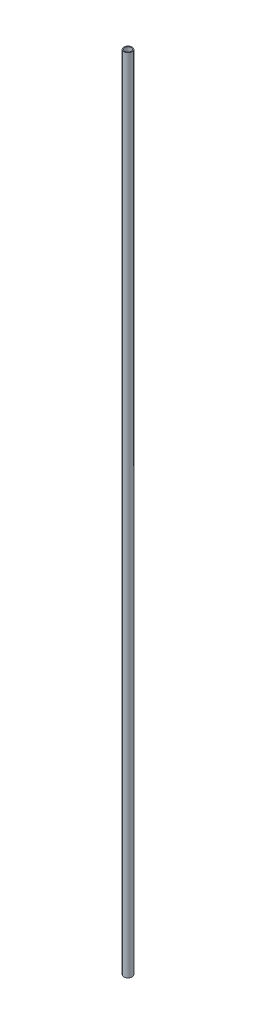
ISO-10303-21;
HEADER;
FILE_DESCRIPTION(('STEP AP214'),'2;1');
FILE_NAME('part.step','',(''),(''),'','','');
FILE_SCHEMA(('AUTOMOTIVE_DESIGN { 1 0 10303 214 1 1 1 1 }'));
ENDSEC;
DATA;
#1=APPLICATION_CONTEXT('core data for automotive mechanical design processes');
#2=APPLICATION_PROTOCOL_DEFINITION('international standard','automotive_design',2000,#1);
#3=PRODUCT_CONTEXT('',#1,'mechanical');
#4=PRODUCT('Part','Part','',(#3));
#5=PRODUCT_RELATED_PRODUCT_CATEGORY('part','',(#4));
#6=PRODUCT_DEFINITION_FORMATION('','',#4);
#7=PRODUCT_DEFINITION_CONTEXT('part definition',#1,'design');
#8=PRODUCT_DEFINITION('design','',#6,#7);
#9=PRODUCT_DEFINITION_SHAPE('','',#8);
#10=(LENGTH_UNIT() NAMED_UNIT(*) SI_UNIT(.MILLI.,.METRE.));
#11=(NAMED_UNIT(*) PLANE_ANGLE_UNIT() SI_UNIT($,.RADIAN.));
#12=(NAMED_UNIT(*) SI_UNIT($,.STERADIAN.) SOLID_ANGLE_UNIT());
#13=UNCERTAINTY_MEASURE_WITH_UNIT(LENGTH_MEASURE(1.E-05),#10,'distance_accuracy_value','');
#14=(GEOMETRIC_REPRESENTATION_CONTEXT(3) GLOBAL_UNCERTAINTY_ASSIGNED_CONTEXT((#13)) GLOBAL_UNIT_ASSIGNED_CONTEXT((#10,
#11,#12)) REPRESENTATION_CONTEXT('',''));
#15=CARTESIAN_POINT('',(0.,0.,0.));
#16=DIRECTION('',(0.,0.,1.));
#17=DIRECTION('',(1.,0.,0.));
#18=AXIS2_PLACEMENT_3D('',#15,#16,#17);
#19=CARTESIAN_POINT('',(0.,0.,0.));
#20=DIRECTION('',(0.,1.,0.));
#21=DIRECTION('',(0.,0.,1.));
#22=AXIS2_PLACEMENT_3D('',#19,#20,#21);
#23=CYLINDRICAL_SURFACE('',#22,5.);
#24=CARTESIAN_POINT('',(0.,1236.994,0.));
#25=DIRECTION('',(0.,1.,0.));
#26=DIRECTION('',(0.,0.,1.));
#27=AXIS2_PLACEMENT_3D('',#24,#25,#26);
#28=CIRCLE('',#27,5.);
#29=CARTESIAN_POINT('',(0.,1236.994,5.));
#30=VERTEX_POINT('',#29);
#31=EDGE_CURVE('E18',#30,#30,#28,.F.);
#32=ORIENTED_EDGE('',*,*,#31,.F.);
#33=EDGE_LOOP('',(#32));
#34=FACE_BOUND('',#33,.T.);
#35=CARTESIAN_POINT('',(0.,0.,0.));
#36=DIRECTION('',(0.,1.,0.));
#37=DIRECTION('',(0.,0.,1.));
#38=AXIS2_PLACEMENT_3D('',#35,#36,#37);
#39=CIRCLE('',#38,5.);
#40=CARTESIAN_POINT('',(0.,0.,5.));
#41=VERTEX_POINT('',#40);
#42=EDGE_CURVE('E27',#41,#41,#39,.F.);
#43=ORIENTED_EDGE('',*,*,#42,.T.);
#44=EDGE_LOOP('',(#43));
#45=FACE_BOUND('',#44,.T.);
#46=ADVANCED_FACE('F15',(#34,#45),#23,.F.);
#47=CARTESIAN_POINT('',(0.,1236.994,0.));
#48=DIRECTION('',(0.,1.,0.));
#49=DIRECTION('',(0.,0.,1.));
#50=AXIS2_PLACEMENT_3D('',#47,#48,#49);
#51=PLANE('',#50);
#52=ORIENTED_EDGE('',*,*,#31,.T.);
#53=EDGE_LOOP('',(#52));
#54=FACE_BOUND('',#53,.T.);
#55=CARTESIAN_POINT('',(0.,1236.994,0.));
#56=DIRECTION('',(0.,1.,0.));
#57=DIRECTION('',(0.,0.,1.));
#58=AXIS2_PLACEMENT_3D('',#55,#56,#57);
#59=CIRCLE('',#58,6.35);
#60=CARTESIAN_POINT('',(0.,1236.994,6.35));
#61=VERTEX_POINT('',#60);
#62=EDGE_CURVE('E22',#61,#61,#59,.F.);
#63=ORIENTED_EDGE('',*,*,#62,.F.);
#64=EDGE_LOOP('',(#63));
#65=FACE_BOUND('',#64,.T.);
#66=ADVANCED_FACE('F35',(#54,#65),#51,.T.);
#67=CARTESIAN_POINT('',(0.,0.,0.));
#68=DIRECTION('',(0.,1.,0.));
#69=DIRECTION('',(0.,0.,1.));
#70=AXIS2_PLACEMENT_3D('',#67,#68,#69);
#71=PLANE('',#70);
#72=ORIENTED_EDGE('',*,*,#42,.F.);
#73=EDGE_LOOP('',(#72));
#74=FACE_BOUND('',#73,.T.);
#75=CARTESIAN_POINT('',(0.,0.,0.));
#76=DIRECTION('',(0.,1.,0.));
#77=DIRECTION('',(0.,0.,1.));
#78=AXIS2_PLACEMENT_3D('',#75,#76,#77);
#79=CIRCLE('',#78,6.35);
#80=CARTESIAN_POINT('',(0.,0.,6.35));
#81=VERTEX_POINT('',#80);
#82=EDGE_CURVE('E10',#81,#81,#79,.T.);
#83=ORIENTED_EDGE('',*,*,#82,.F.);
#84=EDGE_LOOP('',(#83));
#85=FACE_BOUND('',#84,.T.);
#86=ADVANCED_FACE('F43',(#74,#85),#71,.F.);
#87=CARTESIAN_POINT('',(0.,0.,0.));
#88=DIRECTION('',(0.,1.,0.));
#89=DIRECTION('',(0.,0.,1.));
#90=AXIS2_PLACEMENT_3D('',#87,#88,#89);
#91=CYLINDRICAL_SURFACE('',#90,6.35);
#92=ORIENTED_EDGE('',*,*,#62,.T.);
#93=EDGE_LOOP('',(#92));
#94=FACE_BOUND('',#93,.T.);
#95=ORIENTED_EDGE('',*,*,#82,.T.);
#96=EDGE_LOOP('',(#95));
#97=FACE_BOUND('',#96,.T.);
#98=ADVANCED_FACE('F44',(#94,#97),#91,.T.);
#99=CLOSED_SHELL('',(#46,#66,#86,#98));
#100=MANIFOLD_SOLID_BREP('B1',#99);
#101=ADVANCED_BREP_SHAPE_REPRESENTATION('',(#18,#100),#14);
#102=SHAPE_DEFINITION_REPRESENTATION(#9,#101);
ENDSEC;
END-ISO-10303-21;
